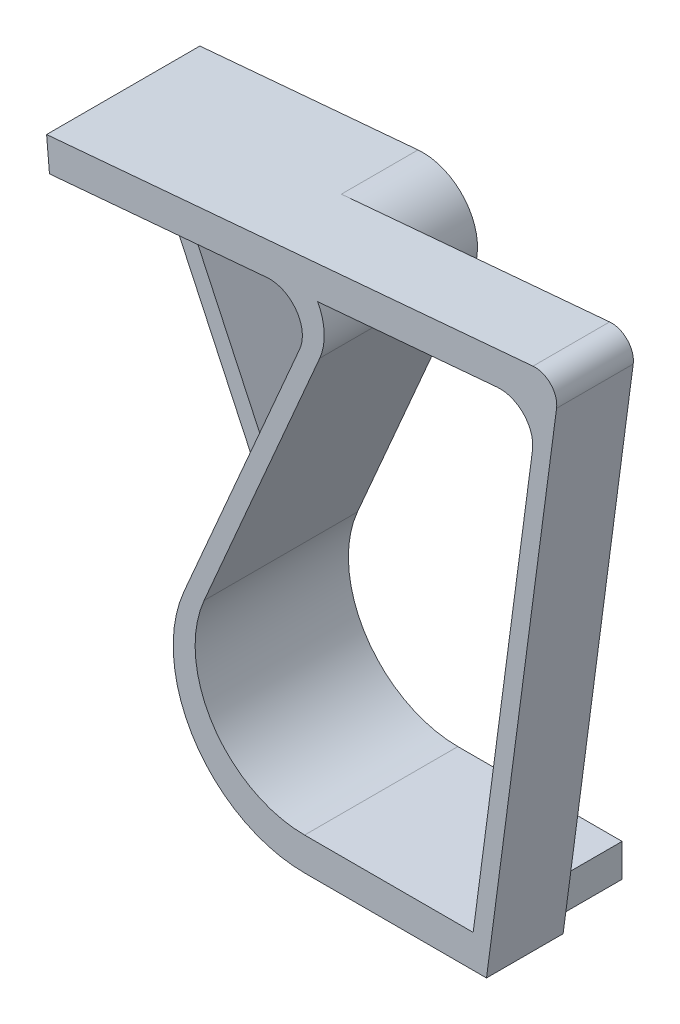
ISO-10303-21;
HEADER;
FILE_DESCRIPTION(('STEP AP214'),'2;1');
FILE_NAME('part.step','',(''),(''),'','','');
FILE_SCHEMA(('AUTOMOTIVE_DESIGN { 1 0 10303 214 1 1 1 1 }'));
ENDSEC;
DATA;
#1=APPLICATION_CONTEXT('core data for automotive mechanical design processes');
#2=APPLICATION_PROTOCOL_DEFINITION('international standard','automotive_design',2000,#1);
#3=PRODUCT_CONTEXT('',#1,'mechanical');
#4=PRODUCT('Part','Part','',(#3));
#5=PRODUCT_RELATED_PRODUCT_CATEGORY('part','',(#4));
#6=PRODUCT_DEFINITION_FORMATION('','',#4);
#7=PRODUCT_DEFINITION_CONTEXT('part definition',#1,'design');
#8=PRODUCT_DEFINITION('design','',#6,#7);
#9=PRODUCT_DEFINITION_SHAPE('','',#8);
#10=(LENGTH_UNIT() NAMED_UNIT(*) SI_UNIT(.MILLI.,.METRE.));
#11=(NAMED_UNIT(*) PLANE_ANGLE_UNIT() SI_UNIT($,.RADIAN.));
#12=(NAMED_UNIT(*) SI_UNIT($,.STERADIAN.) SOLID_ANGLE_UNIT());
#13=UNCERTAINTY_MEASURE_WITH_UNIT(LENGTH_MEASURE(1.E-05),#10,'distance_accuracy_value','');
#14=(GEOMETRIC_REPRESENTATION_CONTEXT(3) GLOBAL_UNCERTAINTY_ASSIGNED_CONTEXT((#13)) GLOBAL_UNIT_ASSIGNED_CONTEXT((#10,
#11,#12)) REPRESENTATION_CONTEXT('',''));
#15=CARTESIAN_POINT('',(0.,0.,0.));
#16=DIRECTION('',(0.,0.,1.));
#17=DIRECTION('',(1.,0.,0.));
#18=AXIS2_PLACEMENT_3D('',#15,#16,#17);
#19=CARTESIAN_POINT('',(2.90125452036853,-14.602706715106,-7.));
#20=DIRECTION('',(0.,0.,1.));
#21=DIRECTION('',(1.,0.,0.));
#22=AXIS2_PLACEMENT_3D('',#19,#20,#21);
#23=CYLINDRICAL_SURFACE('',#22,4.99999999999997);
#24=CARTESIAN_POINT('',(2.90125452036853,-14.602706715106,0.));
#25=DIRECTION('',(0.,0.,1.));
#26=DIRECTION('',(1.,0.,0.));
#27=AXIS2_PLACEMENT_3D('',#24,#25,#26);
#28=CIRCLE('',#27,4.99999999999997);
#29=CARTESIAN_POINT('',(2.46547580663017,-9.62173322464723,0.));
#30=VERTEX_POINT('',#29);
#31=CARTESIAN_POINT('',(7.29208064579228,-12.2109195305312,0.));
#32=VERTEX_POINT('',#31);
#33=EDGE_CURVE('E318',#30,#32,#28,.F.);
#34=ORIENTED_EDGE('',*,*,#33,.T.);
#35=DIRECTION('',(0.,0.,1.));
#36=VECTOR('',#35,1.);
#37=CARTESIAN_POINT('',(7.29208064579228,-12.2109195305312,-7.));
#38=LINE('',#37,#36);
#39=CARTESIAN_POINT('',(7.29208064579227,-12.2109195305312,7.));
#40=VERTEX_POINT('',#39);
#41=EDGE_CURVE('E312',#32,#40,#38,.T.);
#42=ORIENTED_EDGE('',*,*,#41,.T.);
#43=CARTESIAN_POINT('',(2.90125452036853,-14.602706715106,7.));
#44=DIRECTION('',(0.,0.,1.));
#45=DIRECTION('',(1.,0.,0.));
#46=AXIS2_PLACEMENT_3D('',#43,#44,#45);
#47=CIRCLE('',#46,4.99999999999997);
#48=CARTESIAN_POINT('',(7.49108595619679,-16.5859987739522,7.));
#49=VERTEX_POINT('',#48);
#50=EDGE_CURVE('E348',#49,#40,#47,.T.);
#51=ORIENTED_EDGE('',*,*,#50,.F.);
#52=DIRECTION('',(0.,0.,1.));
#53=VECTOR('',#52,1.);
#54=CARTESIAN_POINT('',(7.49108595619679,-16.5859987739522,-7.));
#55=LINE('',#54,#53);
#56=CARTESIAN_POINT('',(7.49108595619679,-16.5859987739522,-7.));
#57=VERTEX_POINT('',#56);
#58=EDGE_CURVE('E389',#57,#49,#55,.T.);
#59=ORIENTED_EDGE('',*,*,#58,.F.);
#60=CARTESIAN_POINT('',(2.90125452036853,-14.602706715106,-7.));
#61=DIRECTION('',(0.,0.,1.));
#62=DIRECTION('',(1.,0.,0.));
#63=AXIS2_PLACEMENT_3D('',#60,#61,#62);
#64=CIRCLE('',#63,4.99999999999997);
#65=CARTESIAN_POINT('',(2.46547580663017,-9.62173322464723,-7.));
#66=VERTEX_POINT('',#65);
#67=EDGE_CURVE('E378',#57,#66,#64,.T.);
#68=ORIENTED_EDGE('',*,*,#67,.T.);
#69=DIRECTION('',(0.,0.,1.));
#70=VECTOR('',#69,1.);
#71=CARTESIAN_POINT('',(2.46547580663017,-9.62173322464723,-7.));
#72=LINE('',#71,#70);
#73=EDGE_CURVE('E386',#66,#30,#72,.T.);
#74=ORIENTED_EDGE('',*,*,#73,.T.);
#75=EDGE_LOOP('',(#34,#42,#51,#59,#68,#74));
#76=FACE_BOUND('',#75,.T.);
#77=ADVANCED_FACE('F34',(#76),#23,.T.);
#78=CARTESIAN_POINT('',(21.1068819651569,-55.,-7.));
#79=DIRECTION('',(1.,0.,0.));
#80=DIRECTION('',(0.,0.,-1.));
#81=AXIS2_PLACEMENT_3D('',#78,#79,#80);
#82=PLANE('',#81);
#83=DIRECTION('',(0.,0.,1.));
#84=VECTOR('',#83,1.);
#85=CARTESIAN_POINT('',(21.1068819651569,-55.,-7.));
#86=LINE('',#85,#84);
#87=CARTESIAN_POINT('',(21.1068819651569,-55.,-7.));
#88=VERTEX_POINT('',#87);
#89=CARTESIAN_POINT('',(21.1068819651569,-55.,0.));
#90=VERTEX_POINT('',#89);
#91=EDGE_CURVE('E395',#88,#90,#86,.T.);
#92=ORIENTED_EDGE('',*,*,#91,.T.);
#93=DIRECTION('',(0.,-1.,0.));
#94=VECTOR('',#93,1.);
#95=CARTESIAN_POINT('',(21.1068819651569,-55.,0.));
#96=LINE('',#95,#94);
#97=CARTESIAN_POINT('',(21.1068819651569,-58.,0.));
#98=VERTEX_POINT('',#97);
#99=EDGE_CURVE('E251',#90,#98,#96,.T.);
#100=ORIENTED_EDGE('',*,*,#99,.T.);
#101=DIRECTION('',(0.,0.,1.));
#102=VECTOR('',#101,1.);
#103=CARTESIAN_POINT('',(21.1068819651569,-58.,-7.));
#104=LINE('',#103,#102);
#105=CARTESIAN_POINT('',(21.1068819651569,-58.,-7.));
#106=VERTEX_POINT('',#105);
#107=EDGE_CURVE('E398',#106,#98,#104,.T.);
#108=ORIENTED_EDGE('',*,*,#107,.F.);
#109=DIRECTION('',(0.,1.,0.));
#110=VECTOR('',#109,1.);
#111=CARTESIAN_POINT('',(21.1068819651569,-55.,-7.));
#112=LINE('',#111,#110);
#113=EDGE_CURVE('E366',#106,#88,#112,.T.);
#114=ORIENTED_EDGE('',*,*,#113,.T.);
#115=EDGE_LOOP('',(#92,#100,#108,#114));
#116=FACE_BOUND('',#115,.T.);
#117=ADVANCED_FACE('F463',(#116),#82,.T.);
#118=CARTESIAN_POINT('',(2.9012545203686,-15.602706715106,-7.));
#119=DIRECTION('',(0.,0.,1.));
#120=DIRECTION('',(1.,0.,0.));
#121=AXIS2_PLACEMENT_3D('',#118,#119,#120);
#122=CYLINDRICAL_SURFACE('',#121,3.00000000000009);
#123=CARTESIAN_POINT('',(2.9012545203686,-15.602706715106,0.));
#124=DIRECTION('',(0.,0.,1.));
#125=DIRECTION('',(1.,0.,0.));
#126=AXIS2_PLACEMENT_3D('',#123,#124,#125);
#127=CIRCLE('',#126,3.00000000000009);
#128=CARTESIAN_POINT('',(2.79059820661116,-12.6047482130206,0.));
#129=VERTEX_POINT('',#128);
#130=CARTESIAN_POINT('',(2.7267217452153,-12.6077879665591,0.));
#131=VERTEX_POINT('',#130);
#132=EDGE_CURVE('E11',#129,#131,#127,.T.);
#133=ORIENTED_EDGE('',*,*,#132,.T.);
#134=DIRECTION('',(0.,0.,1.));
#135=VECTOR('',#134,1.);
#136=CARTESIAN_POINT('',(2.7267217452153,-12.6077879665591,-7.));
#137=LINE('',#136,#135);
#138=CARTESIAN_POINT('',(2.7267217452153,-12.6077879665591,7.));
#139=VERTEX_POINT('',#138);
#140=EDGE_CURVE('E315',#131,#139,#137,.T.);
#141=ORIENTED_EDGE('',*,*,#140,.T.);
#142=CARTESIAN_POINT('',(2.9012545203686,-15.602706715106,7.));
#143=DIRECTION('',(0.,0.,-1.));
#144=DIRECTION('',(1.,0.,0.));
#145=AXIS2_PLACEMENT_3D('',#142,#143,#144);
#146=CIRCLE('',#145,3.00000000000009);
#147=CARTESIAN_POINT('',(2.63978729212588,-12.6141226208307,7.));
#148=VERTEX_POINT('',#147);
#149=EDGE_CURVE('E328',#148,#139,#146,.T.);
#150=ORIENTED_EDGE('',*,*,#149,.F.);
#151=DIRECTION('',(0.,0.,1.));
#152=VECTOR('',#151,1.);
#153=CARTESIAN_POINT('',(2.63978729212588,-12.6141226208307,-7.));
#154=LINE('',#153,#152);
#155=CARTESIAN_POINT('',(2.63978729212588,-12.6141226208307,-7.));
#156=VERTEX_POINT('',#155);
#157=EDGE_CURVE('E408',#156,#148,#154,.T.);
#158=ORIENTED_EDGE('',*,*,#157,.F.);
#159=CARTESIAN_POINT('',(2.9012545203686,-15.602706715106,-7.));
#160=DIRECTION('',(0.,0.,-1.));
#161=DIRECTION('',(1.,0.,0.));
#162=AXIS2_PLACEMENT_3D('',#159,#160,#161);
#163=CIRCLE('',#162,3.00000000000009);
#164=CARTESIAN_POINT('',(5.65515338186569,-16.7926819504137,-7.));
#165=VERTEX_POINT('',#164);
#166=EDGE_CURVE('E217',#156,#165,#163,.T.);
#167=ORIENTED_EDGE('',*,*,#166,.T.);
#168=DIRECTION('',(0.,0.,1.));
#169=VECTOR('',#168,1.);
#170=CARTESIAN_POINT('',(5.65515338186569,-16.7926819504137,-7.));
#171=LINE('',#170,#169);
#172=CARTESIAN_POINT('',(5.65515338186569,-16.7926819504137,7.));
#173=VERTEX_POINT('',#172);
#174=EDGE_CURVE('E405',#165,#173,#171,.T.);
#175=ORIENTED_EDGE('',*,*,#174,.T.);
#176=CARTESIAN_POINT('',(2.79059820661115,-12.6047482130206,7.));
#177=VERTEX_POINT('',#176);
#178=EDGE_CURVE('E327',#177,#173,#146,.T.);
#179=ORIENTED_EDGE('',*,*,#178,.F.);
#180=DIRECTION('',(0.,0.,1.));
#181=VECTOR('',#180,1.);
#182=CARTESIAN_POINT('',(2.79059820661115,-12.6047482130206,-7.));
#183=LINE('',#182,#181);
#184=EDGE_CURVE('E309',#177,#129,#183,.F.);
#185=ORIENTED_EDGE('',*,*,#184,.T.);
#186=EDGE_LOOP('',(#133,#141,#150,#158,#167,#175,#179,#185));
#187=FACE_BOUND('',#186,.T.);
#188=ADVANCED_FACE('F436',(#187),#122,.F.);
#189=CARTESIAN_POINT('',(-17.4584181552045,-11.3648480796005,-7.));
#190=DIRECTION('',(-0.996194698091746,-0.087155742747657,0.));
#191=DIRECTION('',(0.087155742747657,-0.996194698091746,0.));
#192=AXIS2_PLACEMENT_3D('',#189,#190,#191);
#193=PLANE('',#192);
#194=DIRECTION('',(0.,0.,1.));
#195=VECTOR('',#194,1.);
#196=CARTESIAN_POINT('',(-17.1972825808757,-14.34964135229,-7.));
#197=LINE('',#196,#195);
#198=CARTESIAN_POINT('',(-17.1972825808757,-14.34964135229,-7.));
#199=VERTEX_POINT('',#198);
#200=CARTESIAN_POINT('',(-17.1972825808757,-14.34964135229,7.));
#201=VERTEX_POINT('',#200);
#202=EDGE_CURVE('E384',#199,#201,#197,.T.);
#203=ORIENTED_EDGE('',*,*,#202,.T.);
#204=DIRECTION('',(0.087155742747657,-0.996194698091746,0.));
#205=VECTOR('',#204,1.);
#206=CARTESIAN_POINT('',(-17.4584181552045,-11.3648480796005,7.));
#207=LINE('',#206,#205);
#208=CARTESIAN_POINT('',(-17.4584181552045,-11.3648480796005,7.));
#209=VERTEX_POINT('',#208);
#210=EDGE_CURVE('E321',#209,#201,#207,.T.);
#211=ORIENTED_EDGE('',*,*,#210,.F.);
#212=DIRECTION('',(0.,0.,1.));
#213=VECTOR('',#212,1.);
#214=CARTESIAN_POINT('',(-17.4584181552045,-11.3648480796005,-7.));
#215=LINE('',#214,#213);
#216=CARTESIAN_POINT('',(-17.4584181552045,-11.3648480796005,-7.));
#217=VERTEX_POINT('',#216);
#218=EDGE_CURVE('E42',#217,#209,#215,.T.);
#219=ORIENTED_EDGE('',*,*,#218,.F.);
#220=DIRECTION('',(0.087155742747657,-0.996194698091746,0.));
#221=VECTOR('',#220,1.);
#222=CARTESIAN_POINT('',(-17.4584181552045,-11.3648480796005,-7.));
#223=LINE('',#222,#221);
#224=EDGE_CURVE('E354',#217,#199,#223,.T.);
#225=ORIENTED_EDGE('',*,*,#224,.T.);
#226=EDGE_LOOP('',(#203,#211,#219,#225));
#227=FACE_BOUND('',#226,.T.);
#228=ADVANCED_FACE('F36',(#227),#193,.T.);
#229=CARTESIAN_POINT('',(-17.4584181552045,-11.3648480796005,-7.));
#230=DIRECTION('',(-0.0871557427476629,0.996194698091745,0.));
#231=DIRECTION('',(-0.996194698091745,-0.0871557427476629,0.));
#232=AXIS2_PLACEMENT_3D('',#229,#230,#231);
#233=PLANE('',#232);
#234=ORIENTED_EDGE('',*,*,#218,.T.);
#235=DIRECTION('',(-0.996194698091745,-0.0871557427476629,0.));
#236=VECTOR('',#235,1.);
#237=CARTESIAN_POINT('',(-17.4584181552045,-11.3648480796005,7.));
#238=LINE('',#237,#236);
#239=CARTESIAN_POINT('',(26.9658367344632,-7.47822939116823,7.));
#240=VERTEX_POINT('',#239);
#241=EDGE_CURVE('E351',#240,#209,#238,.T.);
#242=ORIENTED_EDGE('',*,*,#241,.F.);
#243=DIRECTION('',(0.,0.,-1.));
#244=VECTOR('',#243,1.);
#245=CARTESIAN_POINT('',(26.9658367344632,-7.47822939116823,7.));
#246=LINE('',#245,#244);
#247=CARTESIAN_POINT('',(26.9658367344632,-7.47822939116823,0.));
#248=VERTEX_POINT('',#247);
#249=EDGE_CURVE('E300',#240,#248,#246,.T.);
#250=ORIENTED_EDGE('',*,*,#249,.T.);
#251=DIRECTION('',(-0.996194698091745,-0.087155742747663,0.));
#252=VECTOR('',#251,1.);
#253=CARTESIAN_POINT('',(2.46547580663017,-9.62173322464723,0.));
#254=LINE('',#253,#252);
#255=EDGE_CURVE('E272',#248,#30,#254,.T.);
#256=ORIENTED_EDGE('',*,*,#255,.T.);
#257=ORIENTED_EDGE('',*,*,#73,.F.);
#258=DIRECTION('',(-0.996194698091745,-0.0871557427476629,0.));
#259=VECTOR('',#258,1.);
#260=CARTESIAN_POINT('',(-17.4584181552045,-11.3648480796005,-7.));
#261=LINE('',#260,#259);
#262=EDGE_CURVE('E381',#66,#217,#261,.T.);
#263=ORIENTED_EDGE('',*,*,#262,.T.);
#264=EDGE_LOOP('',(#234,#242,#250,#256,#257,#263));
#265=FACE_BOUND('',#264,.T.);
#266=ADVANCED_FACE('F424',(#265),#233,.T.);
#267=CARTESIAN_POINT('',(7.49108595619676,-16.5859987739522,-7.));
#268=DIRECTION('',(0.917966287165638,-0.396658411769288,0.));
#269=DIRECTION('',(0.396658411769288,0.917966287165638,0.));
#270=AXIS2_PLACEMENT_3D('',#267,#268,#269);
#271=PLANE('',#270);
#272=ORIENTED_EDGE('',*,*,#58,.T.);
#273=DIRECTION('',(0.396658411769288,0.917966287165638,0.));
#274=VECTOR('',#273,1.);
#275=CARTESIAN_POINT('',(7.49108595619676,-16.5859987739522,7.));
#276=LINE('',#275,#274);
#277=CARTESIAN_POINT('',(-3.07278090649949,-41.0334158823071,7.));
#278=VERTEX_POINT('',#277);
#279=EDGE_CURVE('E345',#278,#49,#276,.T.);
#280=ORIENTED_EDGE('',*,*,#279,.F.);
#281=DIRECTION('',(0.,0.,1.));
#282=VECTOR('',#281,1.);
#283=CARTESIAN_POINT('',(-3.07278090649949,-41.0334158823071,-7.));
#284=LINE('',#283,#282);
#285=CARTESIAN_POINT('',(-3.07278090649949,-41.0334158823071,-7.));
#286=VERTEX_POINT('',#285);
#287=EDGE_CURVE('E391',#286,#278,#284,.T.);
#288=ORIENTED_EDGE('',*,*,#287,.F.);
#289=DIRECTION('',(0.396658411769288,0.917966287165638,0.));
#290=VECTOR('',#289,1.);
#291=CARTESIAN_POINT('',(7.49108595619676,-16.5859987739522,-7.));
#292=LINE('',#291,#290);
#293=EDGE_CURVE('E375',#286,#57,#292,.T.);
#294=ORIENTED_EDGE('',*,*,#293,.T.);
#295=EDGE_LOOP('',(#272,#280,#288,#294));
#296=FACE_BOUND('',#295,.T.);
#297=ADVANCED_FACE('F474',(#296),#271,.T.);
#298=CARTESIAN_POINT('',(6.10688196515687,-45.,-7.));
#299=DIRECTION('',(0.,0.,1.));
#300=DIRECTION('',(1.,0.,0.));
#301=AXIS2_PLACEMENT_3D('',#298,#299,#300);
#302=CYLINDRICAL_SURFACE('',#301,10.);
#303=ORIENTED_EDGE('',*,*,#287,.T.);
#304=CARTESIAN_POINT('',(6.10688196515687,-45.,7.));
#305=DIRECTION('',(0.,0.,-1.));
#306=DIRECTION('',(-1.,0.,0.));
#307=AXIS2_PLACEMENT_3D('',#304,#305,#306);
#308=CIRCLE('',#307,10.);
#309=CARTESIAN_POINT('',(6.10688196515687,-55.,7.));
#310=VERTEX_POINT('',#309);
#311=EDGE_CURVE('E342',#310,#278,#308,.T.);
#312=ORIENTED_EDGE('',*,*,#311,.F.);
#313=DIRECTION('',(0.,0.,1.));
#314=VECTOR('',#313,1.);
#315=CARTESIAN_POINT('',(6.10688196515687,-55.,-7.));
#316=LINE('',#315,#314);
#317=CARTESIAN_POINT('',(6.10688196515687,-55.,-7.));
#318=VERTEX_POINT('',#317);
#319=EDGE_CURVE('E393',#318,#310,#316,.T.);
#320=ORIENTED_EDGE('',*,*,#319,.F.);
#321=CARTESIAN_POINT('',(6.10688196515687,-45.,-7.));
#322=DIRECTION('',(0.,0.,-1.));
#323=DIRECTION('',(-1.,0.,0.));
#324=AXIS2_PLACEMENT_3D('',#321,#322,#323);
#325=CIRCLE('',#324,10.);
#326=EDGE_CURVE('E372',#318,#286,#325,.T.);
#327=ORIENTED_EDGE('',*,*,#326,.T.);
#328=EDGE_LOOP('',(#303,#312,#320,#327));
#329=FACE_BOUND('',#328,.T.);
#330=ADVANCED_FACE('F477',(#329),#302,.F.);
#331=CARTESIAN_POINT('',(6.10688196515687,-55.,-7.));
#332=DIRECTION('',(0.,1.,0.));
#333=DIRECTION('',(-1.,0.,0.));
#334=AXIS2_PLACEMENT_3D('',#331,#332,#333);
#335=PLANE('',#334);
#336=ORIENTED_EDGE('',*,*,#319,.T.);
#337=DIRECTION('',(-1.,0.,0.));
#338=VECTOR('',#337,1.);
#339=CARTESIAN_POINT('',(6.10688196515687,-55.,7.));
#340=LINE('',#339,#338);
#341=CARTESIAN_POINT('',(21.5047915970813,-55.,7.));
#342=VERTEX_POINT('',#341);
#343=EDGE_CURVE('E339',#342,#310,#340,.T.);
#344=ORIENTED_EDGE('',*,*,#343,.F.);
#345=DIRECTION('',(0.,0.,-1.));
#346=VECTOR('',#345,1.);
#347=CARTESIAN_POINT('',(21.5047915970813,-55.,7.));
#348=LINE('',#347,#346);
#349=CARTESIAN_POINT('',(21.5047915970813,-55.,0.));
#350=VERTEX_POINT('',#349);
#351=EDGE_CURVE('E265',#342,#350,#348,.T.);
#352=ORIENTED_EDGE('',*,*,#351,.T.);
#353=DIRECTION('',(-1.,0.,0.));
#354=VECTOR('',#353,1.);
#355=CARTESIAN_POINT('',(21.1068819651569,-55.,0.));
#356=LINE('',#355,#354);
#357=EDGE_CURVE('E285',#350,#90,#356,.T.);
#358=ORIENTED_EDGE('',*,*,#357,.T.);
#359=ORIENTED_EDGE('',*,*,#91,.F.);
#360=DIRECTION('',(-1.,0.,0.));
#361=VECTOR('',#360,1.);
#362=CARTESIAN_POINT('',(6.10688196515687,-55.,-7.));
#363=LINE('',#362,#361);
#364=EDGE_CURVE('E369',#88,#318,#363,.T.);
#365=ORIENTED_EDGE('',*,*,#364,.T.);
#366=EDGE_LOOP('',(#336,#344,#352,#358,#359,#365));
#367=FACE_BOUND('',#366,.T.);
#368=ADVANCED_FACE('F481',(#367),#335,.T.);
#369=CARTESIAN_POINT('',(6.10688196515687,-58.,-7.));
#370=DIRECTION('',(0.,-1.,0.));
#371=DIRECTION('',(0.,0.,-1.));
#372=AXIS2_PLACEMENT_3D('',#369,#370,#371);
#373=PLANE('',#372);
#374=ORIENTED_EDGE('',*,*,#107,.T.);
#375=DIRECTION('',(1.,0.,0.));
#376=VECTOR('',#375,1.);
#377=CARTESIAN_POINT('',(21.1068819651569,-58.,0.));
#378=LINE('',#377,#376);
#379=CARTESIAN_POINT('',(22.7208945670785,-58.,0.));
#380=VERTEX_POINT('',#379);
#381=EDGE_CURVE('E245',#98,#380,#378,.T.);
#382=ORIENTED_EDGE('',*,*,#381,.T.);
#383=DIRECTION('',(0.,0.,-1.));
#384=VECTOR('',#383,1.);
#385=CARTESIAN_POINT('',(22.7208945670785,-58.,7.));
#386=LINE('',#385,#384);
#387=CARTESIAN_POINT('',(22.7208945670785,-58.,7.));
#388=VERTEX_POINT('',#387);
#389=EDGE_CURVE('E306',#388,#380,#386,.T.);
#390=ORIENTED_EDGE('',*,*,#389,.F.);
#391=DIRECTION('',(1.,0.,0.));
#392=VECTOR('',#391,1.);
#393=CARTESIAN_POINT('',(6.10688196515687,-58.,7.));
#394=LINE('',#393,#392);
#395=CARTESIAN_POINT('',(6.10688196515687,-58.,7.));
#396=VERTEX_POINT('',#395);
#397=EDGE_CURVE('E337',#396,#388,#394,.T.);
#398=ORIENTED_EDGE('',*,*,#397,.F.);
#399=DIRECTION('',(0.,0.,1.));
#400=VECTOR('',#399,1.);
#401=CARTESIAN_POINT('',(6.10688196515687,-58.,-7.));
#402=LINE('',#401,#400);
#403=CARTESIAN_POINT('',(6.10688196515687,-58.,-7.));
#404=VERTEX_POINT('',#403);
#405=EDGE_CURVE('E401',#404,#396,#402,.T.);
#406=ORIENTED_EDGE('',*,*,#405,.F.);
#407=DIRECTION('',(1.,0.,0.));
#408=VECTOR('',#407,1.);
#409=CARTESIAN_POINT('',(6.10688196515687,-58.,-7.));
#410=LINE('',#409,#408);
#411=EDGE_CURVE('E363',#404,#106,#410,.T.);
#412=ORIENTED_EDGE('',*,*,#411,.T.);
#413=EDGE_LOOP('',(#374,#382,#390,#398,#406,#412));
#414=FACE_BOUND('',#413,.T.);
#415=ADVANCED_FACE('F484',(#414),#373,.T.);
#416=CARTESIAN_POINT('',(6.10688196515687,-46.,-7.));
#417=DIRECTION('',(0.,0.,1.));
#418=DIRECTION('',(1.,0.,0.));
#419=AXIS2_PLACEMENT_3D('',#416,#417,#418);
#420=CYLINDRICAL_SURFACE('',#419,12.);
#421=ORIENTED_EDGE('',*,*,#405,.T.);
#422=CARTESIAN_POINT('',(6.10688196515687,-46.,7.));
#423=DIRECTION('',(0.,0.,1.));
#424=DIRECTION('',(-1.,0.,0.));
#425=AXIS2_PLACEMENT_3D('',#422,#423,#424);
#426=CIRCLE('',#425,12.);
#427=CARTESIAN_POINT('',(-4.90871348083078,-41.2400990587685,7.));
#428=VERTEX_POINT('',#427);
#429=EDGE_CURVE('E334',#428,#396,#426,.T.);
#430=ORIENTED_EDGE('',*,*,#429,.F.);
#431=DIRECTION('',(0.,0.,1.));
#432=VECTOR('',#431,1.);
#433=CARTESIAN_POINT('',(-4.90871348083078,-41.2400990587685,-7.));
#434=LINE('',#433,#432);
#435=CARTESIAN_POINT('',(-4.90871348083078,-41.2400990587685,-7.));
#436=VERTEX_POINT('',#435);
#437=EDGE_CURVE('E403',#436,#428,#434,.T.);
#438=ORIENTED_EDGE('',*,*,#437,.F.);
#439=CARTESIAN_POINT('',(6.10688196515687,-46.,-7.));
#440=DIRECTION('',(0.,0.,1.));
#441=DIRECTION('',(-1.,0.,0.));
#442=AXIS2_PLACEMENT_3D('',#439,#440,#441);
#443=CIRCLE('',#442,12.);
#444=EDGE_CURVE('E214',#436,#404,#443,.T.);
#445=ORIENTED_EDGE('',*,*,#444,.T.);
#446=EDGE_LOOP('',(#421,#430,#438,#445));
#447=FACE_BOUND('',#446,.T.);
#448=ADVANCED_FACE('F489',(#447),#420,.T.);
#449=CARTESIAN_POINT('',(5.65515338186569,-16.7926819504137,-7.));
#450=DIRECTION('',(-0.917966287165634,0.396658411769296,0.));
#451=DIRECTION('',(-0.396658411769296,-0.917966287165634,0.));
#452=AXIS2_PLACEMENT_3D('',#449,#450,#451);
#453=PLANE('',#452);
#454=DIRECTION('',(0.,0.,1.));
#455=VECTOR('',#454,1.);
#456=CARTESIAN_POINT('',(-2.92955003974151,-36.6598222719816,-7.));
#457=LINE('',#456,#455);
#458=CARTESIAN_POINT('',(-2.92955003974152,-36.6598222719816,-7.));
#459=VERTEX_POINT('',#458);
#460=CARTESIAN_POINT('',(-2.92955003974151,-36.6598222719816,0.));
#461=VERTEX_POINT('',#460);
#462=EDGE_CURVE('E54',#459,#461,#457,.T.);
#463=ORIENTED_EDGE('',*,*,#462,.T.);
#464=DIRECTION('',(0.396658411769297,0.917966287165634,0.));
#465=VECTOR('',#464,1.);
#466=CARTESIAN_POINT('',(-2.92955003974151,-36.6598222719816,0.));
#467=LINE('',#466,#465);
#468=CARTESIAN_POINT('',(-3.77818530012292,-38.6237754770967,0.));
#469=VERTEX_POINT('',#468);
#470=EDGE_CURVE('E49',#469,#461,#467,.T.);
#471=ORIENTED_EDGE('',*,*,#470,.F.);
#472=DIRECTION('',(0.,0.,1.));
#473=VECTOR('',#472,1.);
#474=CARTESIAN_POINT('',(-3.77818530012292,-38.6237754770967,-7.));
#475=LINE('',#474,#473);
#476=CARTESIAN_POINT('',(-3.77818530012292,-38.6237754770967,-7.));
#477=VERTEX_POINT('',#476);
#478=EDGE_CURVE('E219',#477,#469,#475,.T.);
#479=ORIENTED_EDGE('',*,*,#478,.F.);
#480=DIRECTION('',(-0.396658411769296,-0.917966287165634,0.));
#481=VECTOR('',#480,1.);
#482=CARTESIAN_POINT('',(5.65515338186569,-16.7926819504137,-7.));
#483=LINE('',#482,#481);
#484=EDGE_CURVE('E206',#477,#436,#483,.T.);
#485=ORIENTED_EDGE('',*,*,#484,.T.);
#486=ORIENTED_EDGE('',*,*,#437,.T.);
#487=DIRECTION('',(-0.396658411769296,-0.917966287165634,0.));
#488=VECTOR('',#487,1.);
#489=CARTESIAN_POINT('',(5.65515338186569,-16.7926819504137,7.));
#490=LINE('',#489,#488);
#491=EDGE_CURVE('E331',#173,#428,#490,.T.);
#492=ORIENTED_EDGE('',*,*,#491,.F.);
#493=ORIENTED_EDGE('',*,*,#174,.F.);
#494=EDGE_CURVE('E216',#165,#459,#483,.T.);
#495=ORIENTED_EDGE('',*,*,#494,.T.);
#496=EDGE_LOOP('',(#463,#471,#479,#485,#486,#492,#493,#495));
#497=FACE_BOUND('',#496,.T.);
#498=ADVANCED_FACE('F220',(#497),#453,.T.);
#499=CARTESIAN_POINT('',(-17.1972825808757,-14.34964135229,-7.));
#500=DIRECTION('',(0.0871557427476628,-0.996194698091745,0.));
#501=DIRECTION('',(0.996194698091745,0.0871557427476628,0.));
#502=AXIS2_PLACEMENT_3D('',#499,#500,#501);
#503=PLANE('',#502);
#504=DIRECTION('',(0.,0.,1.));
#505=VECTOR('',#504,1.);
#506=CARTESIAN_POINT('',(-13.5006977345265,-14.0262320844727,-7.));
#507=LINE('',#506,#505);
#508=CARTESIAN_POINT('',(-13.5006977345265,-14.0262320844727,-7.));
#509=VERTEX_POINT('',#508);
#510=CARTESIAN_POINT('',(-13.5006977345265,-14.0262320844727,0.));
#511=VERTEX_POINT('',#510);
#512=EDGE_CURVE('E242',#509,#511,#507,.T.);
#513=ORIENTED_EDGE('',*,*,#512,.F.);
#514=DIRECTION('',(0.996194698091745,0.0871557427476628,0.));
#515=VECTOR('',#514,1.);
#516=CARTESIAN_POINT('',(-17.1972825808757,-14.34964135229,-7.));
#517=LINE('',#516,#515);
#518=EDGE_CURVE('E357',#509,#156,#517,.T.);
#519=ORIENTED_EDGE('',*,*,#518,.T.);
#520=ORIENTED_EDGE('',*,*,#157,.T.);
#521=DIRECTION('',(0.996194698091745,0.0871557427476628,0.));
#522=VECTOR('',#521,1.);
#523=CARTESIAN_POINT('',(-17.1972825808757,-14.34964135229,7.));
#524=LINE('',#523,#522);
#525=EDGE_CURVE('E324',#201,#148,#524,.T.);
#526=ORIENTED_EDGE('',*,*,#525,.F.);
#527=ORIENTED_EDGE('',*,*,#202,.F.);
#528=CARTESIAN_POINT('',(-15.1972825808757,-14.1746640252382,-7.));
#529=VERTEX_POINT('',#528);
#530=EDGE_CURVE('E358',#199,#529,#517,.T.);
#531=ORIENTED_EDGE('',*,*,#530,.T.);
#532=DIRECTION('',(0.,0.,1.));
#533=VECTOR('',#532,1.);
#534=CARTESIAN_POINT('',(-15.1972825808757,-14.1746640252382,-7.));
#535=LINE('',#534,#533);
#536=CARTESIAN_POINT('',(-15.1972825808757,-14.1746640252382,0.));
#537=VERTEX_POINT('',#536);
#538=EDGE_CURVE('E224',#529,#537,#535,.T.);
#539=ORIENTED_EDGE('',*,*,#538,.T.);
#540=DIRECTION('',(-0.996194698091745,-0.0871557427476617,0.));
#541=VECTOR('',#540,1.);
#542=CARTESIAN_POINT('',(-15.1972825808757,-14.1746640252382,0.));
#543=LINE('',#542,#541);
#544=EDGE_CURVE('E236',#511,#537,#543,.T.);
#545=ORIENTED_EDGE('',*,*,#544,.F.);
#546=EDGE_LOOP('',(#513,#519,#520,#526,#527,#531,#539,#545));
#547=FACE_BOUND('',#546,.T.);
#548=ADVANCED_FACE('F415',(#547),#503,.T.);
#549=CARTESIAN_POINT('',(2.9012545203686,-15.602706715106,-7.));
#550=DIRECTION('',(0.,0.,1.));
#551=DIRECTION('',(1.,0.,0.));
#552=AXIS2_PLACEMENT_3D('',#549,#550,#551);
#553=PLANE('',#552);
#554=DIRECTION('',(0.423174904072571,-0.90604801228366,0.));
#555=VECTOR('',#554,1.);
#556=CARTESIAN_POINT('',(-15.1972825808757,-14.1746640252382,-7.));
#557=LINE('',#556,#555);
#558=EDGE_CURVE('E211',#529,#477,#557,.T.);
#559=ORIENTED_EDGE('',*,*,#558,.F.);
#560=ORIENTED_EDGE('',*,*,#530,.F.);
#561=ORIENTED_EDGE('',*,*,#224,.F.);
#562=ORIENTED_EDGE('',*,*,#262,.F.);
#563=ORIENTED_EDGE('',*,*,#67,.F.);
#564=ORIENTED_EDGE('',*,*,#293,.F.);
#565=ORIENTED_EDGE('',*,*,#326,.F.);
#566=ORIENTED_EDGE('',*,*,#364,.F.);
#567=ORIENTED_EDGE('',*,*,#113,.F.);
#568=ORIENTED_EDGE('',*,*,#411,.F.);
#569=ORIENTED_EDGE('',*,*,#444,.F.);
#570=ORIENTED_EDGE('',*,*,#484,.F.);
#571=EDGE_LOOP('',(#559,#560,#561,#562,#563,#564,#565,#566,#567,#568,#569,#570));
#572=FACE_BOUND('',#571,.T.);
#573=ORIENTED_EDGE('',*,*,#518,.F.);
#574=DIRECTION('',(-0.42317490407257,0.90604801228366,0.));
#575=VECTOR('',#574,1.);
#576=CARTESIAN_POINT('',(-13.5006977345265,-14.0262320844727,-7.));
#577=LINE('',#576,#575);
#578=EDGE_CURVE('E228',#459,#509,#577,.T.);
#579=ORIENTED_EDGE('',*,*,#578,.F.);
#580=ORIENTED_EDGE('',*,*,#494,.F.);
#581=ORIENTED_EDGE('',*,*,#166,.F.);
#582=EDGE_LOOP('',(#573,#579,#580,#581));
#583=FACE_BOUND('',#582,.T.);
#584=ADVANCED_FACE('F207',(#572,#583),#553,.F.);
#585=CARTESIAN_POINT('',(2.9012545203686,-15.602706715106,7.));
#586=DIRECTION('',(0.,0.,1.));
#587=DIRECTION('',(1.,0.,0.));
#588=AXIS2_PLACEMENT_3D('',#585,#586,#587);
#589=PLANE('',#588);
#590=CARTESIAN_POINT('',(27.1401482199586,-9.47061878735172,7.));
#591=DIRECTION('',(0.,0.,1.));
#592=DIRECTION('',(1.,0.,0.));
#593=AXIS2_PLACEMENT_3D('',#590,#591,#592);
#594=CIRCLE('',#593,2.);
#595=CARTESIAN_POINT('',(29.1227845365463,-9.73358881634289,7.));
#596=VERTEX_POINT('',#595);
#597=EDGE_CURVE('E250',#596,#240,#594,.T.);
#598=ORIENTED_EDGE('',*,*,#597,.T.);
#599=ORIENTED_EDGE('',*,*,#241,.T.);
#600=ORIENTED_EDGE('',*,*,#210,.T.);
#601=ORIENTED_EDGE('',*,*,#525,.T.);
#602=ORIENTED_EDGE('',*,*,#149,.T.);
#603=DIRECTION('',(0.0871557427476622,-0.996194698091745,0.));
#604=VECTOR('',#603,1.);
#605=CARTESIAN_POINT('',(2.46547580663017,-9.62173322464723,7.));
#606=LINE('',#605,#604);
#607=CARTESIAN_POINT('',(2.72694303487316,-12.6103173189225,7.));
#608=VERTEX_POINT('',#607);
#609=EDGE_CURVE('E254',#139,#608,#606,.T.);
#610=ORIENTED_EDGE('',*,*,#609,.T.);
#611=DIRECTION('',(0.996194698091745,0.0871557427476628,0.));
#612=VECTOR('',#611,1.);
#613=CARTESIAN_POINT('',(2.72694303487316,-12.6103173189225,7.));
#614=LINE('',#613,#612);
#615=EDGE_CURVE('E257',#608,#177,#614,.T.);
#616=ORIENTED_EDGE('',*,*,#615,.T.);
#617=ORIENTED_EDGE('',*,*,#178,.T.);
#618=ORIENTED_EDGE('',*,*,#491,.T.);
#619=ORIENTED_EDGE('',*,*,#429,.T.);
#620=ORIENTED_EDGE('',*,*,#397,.T.);
#621=DIRECTION('',(0.131485014495577,0.991318158293844,0.));
#622=VECTOR('',#621,1.);
#623=CARTESIAN_POINT('',(22.7208945670785,-58.,7.));
#624=LINE('',#623,#622);
#625=EDGE_CURVE('E248',#388,#596,#624,.T.);
#626=ORIENTED_EDGE('',*,*,#625,.T.);
#627=EDGE_LOOP('',(#598,#599,#600,#601,#602,#610,#616,#617,#618,#619,#620,#626));
#628=FACE_BOUND('',#627,.T.);
#629=ORIENTED_EDGE('',*,*,#50,.T.);
#630=CARTESIAN_POINT('',(23.6862926438861,-10.7766118332572,7.));
#631=VERTEX_POINT('',#630);
#632=EDGE_CURVE('E256',#40,#631,#614,.T.);
#633=ORIENTED_EDGE('',*,*,#632,.T.);
#634=CARTESIAN_POINT('',(23.9477598721291,-13.7651959275325,7.));
#635=DIRECTION('',(0.,0.,-1.));
#636=DIRECTION('',(1.,0.,0.));
#637=AXIS2_PLACEMENT_3D('',#634,#635,#636);
#638=CIRCLE('',#637,3.);
#639=CARTESIAN_POINT('',(26.9217143470106,-14.1596509710192,7.));
#640=VERTEX_POINT('',#639);
#641=EDGE_CURVE('E260',#631,#640,#638,.T.);
#642=ORIENTED_EDGE('',*,*,#641,.T.);
#643=DIRECTION('',(-0.131485014495577,-0.991318158293844,0.));
#644=VECTOR('',#643,1.);
#645=CARTESIAN_POINT('',(21.5047915970813,-55.,7.));
#646=LINE('',#645,#644);
#647=EDGE_CURVE('E262',#640,#342,#646,.T.);
#648=ORIENTED_EDGE('',*,*,#647,.T.);
#649=ORIENTED_EDGE('',*,*,#343,.T.);
#650=ORIENTED_EDGE('',*,*,#311,.T.);
#651=ORIENTED_EDGE('',*,*,#279,.T.);
#652=EDGE_LOOP('',(#629,#633,#642,#648,#649,#650,#651));
#653=FACE_BOUND('',#652,.T.);
#654=ADVANCED_FACE('F419',(#628,#653),#589,.T.);
#655=CARTESIAN_POINT('',(21.5047915970813,-55.,7.));
#656=DIRECTION('',(0.991318158293844,-0.131485014495577,0.));
#657=DIRECTION('',(0.131485014495577,0.991318158293844,0.));
#658=AXIS2_PLACEMENT_3D('',#655,#656,#657);
#659=PLANE('',#658);
#660=DIRECTION('',(-0.131485014495577,-0.991318158293844,0.));
#661=VECTOR('',#660,1.);
#662=CARTESIAN_POINT('',(21.5047915970813,-55.,0.));
#663=LINE('',#662,#661);
#664=CARTESIAN_POINT('',(26.9217143470106,-14.1596509710192,0.));
#665=VERTEX_POINT('',#664);
#666=EDGE_CURVE('E283',#665,#350,#663,.T.);
#667=ORIENTED_EDGE('',*,*,#666,.T.);
#668=ORIENTED_EDGE('',*,*,#351,.F.);
#669=ORIENTED_EDGE('',*,*,#647,.F.);
#670=DIRECTION('',(0.,0.,-1.));
#671=VECTOR('',#670,1.);
#672=CARTESIAN_POINT('',(26.9217143470106,-14.1596509710192,7.));
#673=LINE('',#672,#671);
#674=EDGE_CURVE('E291',#640,#665,#673,.T.);
#675=ORIENTED_EDGE('',*,*,#674,.T.);
#676=EDGE_LOOP('',(#667,#668,#669,#675));
#677=FACE_BOUND('',#676,.T.);
#678=ADVANCED_FACE('F504',(#677),#659,.F.);
#679=CARTESIAN_POINT('',(23.9477598721291,-13.7651959275325,7.));
#680=DIRECTION('',(0.,0.,-1.));
#681=DIRECTION('',(-1.,0.,0.));
#682=AXIS2_PLACEMENT_3D('',#679,#680,#681);
#683=CYLINDRICAL_SURFACE('',#682,3.);
#684=CARTESIAN_POINT('',(23.9477598721291,-13.7651959275325,0.));
#685=DIRECTION('',(0.,0.,-1.));
#686=DIRECTION('',(1.,0.,0.));
#687=AXIS2_PLACEMENT_3D('',#684,#685,#686);
#688=CIRCLE('',#687,3.);
#689=CARTESIAN_POINT('',(23.6862926438861,-10.7766118332572,0.));
#690=VERTEX_POINT('',#689);
#691=EDGE_CURVE('E281',#690,#665,#688,.T.);
#692=ORIENTED_EDGE('',*,*,#691,.T.);
#693=ORIENTED_EDGE('',*,*,#674,.F.);
#694=ORIENTED_EDGE('',*,*,#641,.F.);
#695=DIRECTION('',(0.,0.,-1.));
#696=VECTOR('',#695,1.);
#697=CARTESIAN_POINT('',(23.6862926438861,-10.7766118332572,7.));
#698=LINE('',#697,#696);
#699=EDGE_CURVE('E294',#631,#690,#698,.T.);
#700=ORIENTED_EDGE('',*,*,#699,.T.);
#701=EDGE_LOOP('',(#692,#693,#694,#700));
#702=FACE_BOUND('',#701,.T.);
#703=ADVANCED_FACE('F512',(#702),#683,.F.);
#704=CARTESIAN_POINT('',(27.1401482199586,-9.47061878735172,7.));
#705=DIRECTION('',(0.,0.,-1.));
#706=DIRECTION('',(-1.,0.,0.));
#707=AXIS2_PLACEMENT_3D('',#704,#705,#706);
#708=CYLINDRICAL_SURFACE('',#707,2.);
#709=CARTESIAN_POINT('',(27.1401482199586,-9.47061878735172,0.));
#710=DIRECTION('',(0.,0.,1.));
#711=DIRECTION('',(1.,0.,0.));
#712=AXIS2_PLACEMENT_3D('',#709,#710,#711);
#713=CIRCLE('',#712,2.);
#714=CARTESIAN_POINT('',(29.1227845365463,-9.73358881634289,0.));
#715=VERTEX_POINT('',#714);
#716=EDGE_CURVE('E270',#715,#248,#713,.T.);
#717=ORIENTED_EDGE('',*,*,#716,.T.);
#718=ORIENTED_EDGE('',*,*,#249,.F.);
#719=ORIENTED_EDGE('',*,*,#597,.F.);
#720=DIRECTION('',(0.,0.,-1.));
#721=VECTOR('',#720,1.);
#722=CARTESIAN_POINT('',(29.1227845365463,-9.73358881634289,7.));
#723=LINE('',#722,#721);
#724=EDGE_CURVE('E303',#596,#715,#723,.T.);
#725=ORIENTED_EDGE('',*,*,#724,.T.);
#726=EDGE_LOOP('',(#717,#718,#719,#725));
#727=FACE_BOUND('',#726,.T.);
#728=ADVANCED_FACE('F509',(#727),#708,.T.);
#729=CARTESIAN_POINT('',(22.7208945670785,-58.,7.));
#730=DIRECTION('',(-0.991318158293844,0.131485014495577,0.));
#731=DIRECTION('',(-0.131485014495577,-0.991318158293844,0.));
#732=AXIS2_PLACEMENT_3D('',#729,#730,#731);
#733=PLANE('',#732);
#734=DIRECTION('',(0.131485014495577,0.991318158293844,0.));
#735=VECTOR('',#734,1.);
#736=CARTESIAN_POINT('',(22.7208945670785,-58.,0.));
#737=LINE('',#736,#735);
#738=EDGE_CURVE('E268',#380,#715,#737,.T.);
#739=ORIENTED_EDGE('',*,*,#738,.T.);
#740=ORIENTED_EDGE('',*,*,#724,.F.);
#741=ORIENTED_EDGE('',*,*,#625,.F.);
#742=ORIENTED_EDGE('',*,*,#389,.T.);
#743=EDGE_LOOP('',(#739,#740,#741,#742));
#744=FACE_BOUND('',#743,.T.);
#745=ADVANCED_FACE('F507',(#744),#733,.F.);
#746=CARTESIAN_POINT('',(2.72694303487316,-12.6103173189225,7.));
#747=DIRECTION('',(-0.0871557427476628,0.996194698091745,0.));
#748=DIRECTION('',(-0.996194698091745,-0.0871557427476628,0.));
#749=AXIS2_PLACEMENT_3D('',#746,#747,#748);
#750=PLANE('',#749);
#751=ORIENTED_EDGE('',*,*,#41,.F.);
#752=DIRECTION('',(0.996194698091745,0.0871557427476628,0.));
#753=VECTOR('',#752,1.);
#754=CARTESIAN_POINT('',(2.72694303487316,-12.6103173189225,0.));
#755=LINE('',#754,#753);
#756=EDGE_CURVE('E277',#32,#690,#755,.T.);
#757=ORIENTED_EDGE('',*,*,#756,.T.);
#758=ORIENTED_EDGE('',*,*,#699,.F.);
#759=ORIENTED_EDGE('',*,*,#632,.F.);
#760=EDGE_LOOP('',(#751,#757,#758,#759));
#761=FACE_BOUND('',#760,.T.);
#762=ADVANCED_FACE('F458',(#761),#750,.F.);
#763=CARTESIAN_POINT('',(27.1401482199586,-9.47061878735172,0.));
#764=DIRECTION('',(0.,0.,1.));
#765=DIRECTION('',(1.,0.,0.));
#766=AXIS2_PLACEMENT_3D('',#763,#764,#765);
#767=PLANE('',#766);
#768=ORIENTED_EDGE('',*,*,#33,.F.);
#769=ORIENTED_EDGE('',*,*,#255,.F.);
#770=ORIENTED_EDGE('',*,*,#716,.F.);
#771=ORIENTED_EDGE('',*,*,#738,.F.);
#772=ORIENTED_EDGE('',*,*,#381,.F.);
#773=ORIENTED_EDGE('',*,*,#99,.F.);
#774=ORIENTED_EDGE('',*,*,#357,.F.);
#775=ORIENTED_EDGE('',*,*,#666,.F.);
#776=ORIENTED_EDGE('',*,*,#691,.F.);
#777=ORIENTED_EDGE('',*,*,#756,.F.);
#778=EDGE_LOOP('',(#768,#769,#770,#771,#772,#773,#774,#775,#776,#777));
#779=FACE_BOUND('',#778,.T.);
#780=ADVANCED_FACE('F459',(#779),#767,.F.);
#781=ORIENTED_EDGE('',*,*,#132,.F.);
#782=CARTESIAN_POINT('',(2.72694303487316,-12.6103173189225,0.));
#783=VERTEX_POINT('',#782);
#784=EDGE_CURVE('E278',#783,#129,#755,.T.);
#785=ORIENTED_EDGE('',*,*,#784,.F.);
#786=DIRECTION('',(0.0871557427476622,-0.996194698091745,0.));
#787=VECTOR('',#786,1.);
#788=CARTESIAN_POINT('',(2.46547580663017,-9.62173322464723,0.));
#789=LINE('',#788,#787);
#790=EDGE_CURVE('E275',#131,#783,#789,.T.);
#791=ORIENTED_EDGE('',*,*,#790,.F.);
#792=EDGE_LOOP('',(#781,#785,#791));
#793=FACE_BOUND('',#792,.T.);
#794=ADVANCED_FACE('F447',(#793),#767,.F.);
#795=CARTESIAN_POINT('',(2.46547580663017,-9.62173322464723,7.));
#796=DIRECTION('',(0.996194698091745,0.0871557427476622,0.));
#797=DIRECTION('',(-0.0871557427476622,0.996194698091745,0.));
#798=AXIS2_PLACEMENT_3D('',#795,#796,#797);
#799=PLANE('',#798);
#800=ORIENTED_EDGE('',*,*,#140,.F.);
#801=ORIENTED_EDGE('',*,*,#790,.T.);
#802=DIRECTION('',(0.,0.,-1.));
#803=VECTOR('',#802,1.);
#804=CARTESIAN_POINT('',(2.72694303487316,-12.6103173189225,7.));
#805=LINE('',#804,#803);
#806=EDGE_CURVE('E297',#608,#783,#805,.T.);
#807=ORIENTED_EDGE('',*,*,#806,.F.);
#808=ORIENTED_EDGE('',*,*,#609,.F.);
#809=EDGE_LOOP('',(#800,#801,#807,#808));
#810=FACE_BOUND('',#809,.T.);
#811=ADVANCED_FACE('F450',(#810),#799,.F.);
#812=ORIENTED_EDGE('',*,*,#184,.F.);
#813=ORIENTED_EDGE('',*,*,#615,.F.);
#814=ORIENTED_EDGE('',*,*,#806,.T.);
#815=ORIENTED_EDGE('',*,*,#784,.T.);
#816=EDGE_LOOP('',(#812,#813,#814,#815));
#817=FACE_BOUND('',#816,.T.);
#818=ADVANCED_FACE('F444',(#817),#750,.F.);
#819=CARTESIAN_POINT('',(-13.5006977345265,-14.0262320844727,-7.));
#820=DIRECTION('',(0.90604801228366,0.42317490407257,0.));
#821=DIRECTION('',(-0.42317490407257,0.90604801228366,0.));
#822=AXIS2_PLACEMENT_3D('',#819,#820,#821);
#823=PLANE('',#822);
#824=DIRECTION('',(-0.42317490407257,0.90604801228366,0.));
#825=VECTOR('',#824,1.);
#826=CARTESIAN_POINT('',(-13.5006977345265,-14.0262320844727,0.));
#827=LINE('',#826,#825);
#828=EDGE_CURVE('E229',#461,#511,#827,.T.);
#829=ORIENTED_EDGE('',*,*,#828,.F.);
#830=ORIENTED_EDGE('',*,*,#462,.F.);
#831=ORIENTED_EDGE('',*,*,#578,.T.);
#832=ORIENTED_EDGE('',*,*,#512,.T.);
#833=EDGE_LOOP('',(#829,#830,#831,#832));
#834=FACE_BOUND('',#833,.T.);
#835=ADVANCED_FACE('F432',(#834),#823,.T.);
#836=CARTESIAN_POINT('',(-15.1972825808757,-14.1746640252382,-7.));
#837=DIRECTION('',(-0.90604801228366,-0.423174904072571,0.));
#838=DIRECTION('',(0.423174904072571,-0.90604801228366,0.));
#839=AXIS2_PLACEMENT_3D('',#836,#837,#838);
#840=PLANE('',#839);
#841=DIRECTION('',(0.423174904072571,-0.90604801228366,0.));
#842=VECTOR('',#841,1.);
#843=CARTESIAN_POINT('',(-15.1972825808757,-14.1746640252382,0.));
#844=LINE('',#843,#842);
#845=EDGE_CURVE('E239',#537,#469,#844,.T.);
#846=ORIENTED_EDGE('',*,*,#845,.F.);
#847=ORIENTED_EDGE('',*,*,#538,.F.);
#848=ORIENTED_EDGE('',*,*,#558,.T.);
#849=ORIENTED_EDGE('',*,*,#478,.T.);
#850=EDGE_LOOP('',(#846,#847,#848,#849));
#851=FACE_BOUND('',#850,.T.);
#852=ADVANCED_FACE('F227',(#851),#840,.T.);
#853=CARTESIAN_POINT('',(0.,0.,0.));
#854=DIRECTION('',(0.,0.,-1.));
#855=DIRECTION('',(-1.,0.,0.));
#856=AXIS2_PLACEMENT_3D('',#853,#854,#855);
#857=PLANE('',#856);
#858=ORIENTED_EDGE('',*,*,#544,.T.);
#859=ORIENTED_EDGE('',*,*,#845,.T.);
#860=ORIENTED_EDGE('',*,*,#470,.T.);
#861=ORIENTED_EDGE('',*,*,#828,.T.);
#862=EDGE_LOOP('',(#858,#859,#860,#861));
#863=FACE_BOUND('',#862,.T.);
#864=ADVANCED_FACE('F429',(#863),#857,.F.);
#865=CLOSED_SHELL('',(#77,#117,#188,#228,#266,#297,#330,#368,#415,#448,#498,#548,#584,#654,#678,
#703,#728,#745,#762,#780,#794,#811,#818,#835,#852,#864));
#866=MANIFOLD_SOLID_BREP('B2',#865);
#867=ADVANCED_BREP_SHAPE_REPRESENTATION('',(#18,#866),#14);
#868=SHAPE_DEFINITION_REPRESENTATION(#9,#867);
ENDSEC;
END-ISO-10303-21;
